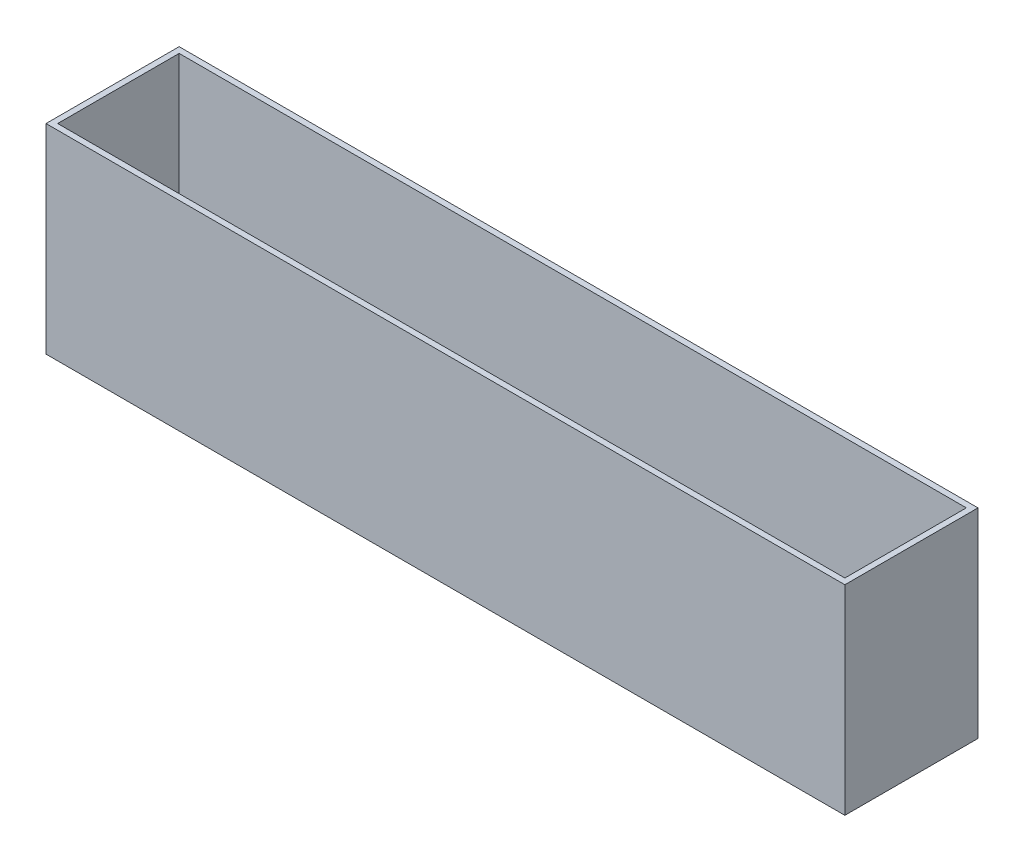
ISO-10303-21;
HEADER;
FILE_DESCRIPTION(('STEP AP214'),'2;1');
FILE_NAME('part.step','',(''),(''),'','','');
FILE_SCHEMA(('AUTOMOTIVE_DESIGN { 1 0 10303 214 1 1 1 1 }'));
ENDSEC;
DATA;
#1=APPLICATION_CONTEXT('core data for automotive mechanical design processes');
#2=APPLICATION_PROTOCOL_DEFINITION('international standard','automotive_design',2000,#1);
#3=PRODUCT_CONTEXT('',#1,'mechanical');
#4=PRODUCT('Part','Part','',(#3));
#5=PRODUCT_RELATED_PRODUCT_CATEGORY('part','',(#4));
#6=PRODUCT_DEFINITION_FORMATION('','',#4);
#7=PRODUCT_DEFINITION_CONTEXT('part definition',#1,'design');
#8=PRODUCT_DEFINITION('design','',#6,#7);
#9=PRODUCT_DEFINITION_SHAPE('','',#8);
#10=(LENGTH_UNIT() NAMED_UNIT(*) SI_UNIT(.MILLI.,.METRE.));
#11=(NAMED_UNIT(*) PLANE_ANGLE_UNIT() SI_UNIT($,.RADIAN.));
#12=(NAMED_UNIT(*) SI_UNIT($,.STERADIAN.) SOLID_ANGLE_UNIT());
#13=UNCERTAINTY_MEASURE_WITH_UNIT(LENGTH_MEASURE(1.E-05),#10,'distance_accuracy_value','');
#14=(GEOMETRIC_REPRESENTATION_CONTEXT(3) GLOBAL_UNCERTAINTY_ASSIGNED_CONTEXT((#13)) GLOBAL_UNIT_ASSIGNED_CONTEXT((#10,
#11,#12)) REPRESENTATION_CONTEXT('',''));
#15=CARTESIAN_POINT('',(0.,0.,0.));
#16=DIRECTION('',(0.,0.,1.));
#17=DIRECTION('',(1.,0.,0.));
#18=AXIS2_PLACEMENT_3D('',#15,#16,#17);
#19=CARTESIAN_POINT('',(0.,300.,0.));
#20=DIRECTION('',(1.,0.,0.));
#21=DIRECTION('',(0.,0.,-1.));
#22=AXIS2_PLACEMENT_3D('',#19,#20,#21);
#23=PLANE('',#22);
#24=DIRECTION('',(0.,0.,1.));
#25=VECTOR('',#24,1.);
#26=CARTESIAN_POINT('',(0.,0.,0.));
#27=LINE('',#26,#25);
#28=CARTESIAN_POINT('',(0.,0.,-200.));
#29=VERTEX_POINT('',#28);
#30=CARTESIAN_POINT('',(0.,0.,0.));
#31=VERTEX_POINT('',#30);
#32=EDGE_CURVE('E158',#29,#31,#27,.T.);
#33=ORIENTED_EDGE('',*,*,#32,.T.);
#34=DIRECTION('',(0.,-1.,0.));
#35=VECTOR('',#34,1.);
#36=CARTESIAN_POINT('',(0.,300.,0.));
#37=LINE('',#36,#35);
#38=CARTESIAN_POINT('',(0.,300.,0.));
#39=VERTEX_POINT('',#38);
#40=EDGE_CURVE('E11',#39,#31,#37,.T.);
#41=ORIENTED_EDGE('',*,*,#40,.F.);
#42=DIRECTION('',(0.,0.,1.));
#43=VECTOR('',#42,1.);
#44=CARTESIAN_POINT('',(0.,300.,0.));
#45=LINE('',#44,#43);
#46=CARTESIAN_POINT('',(0.,300.,-200.));
#47=VERTEX_POINT('',#46);
#48=EDGE_CURVE('E164',#47,#39,#45,.T.);
#49=ORIENTED_EDGE('',*,*,#48,.F.);
#50=DIRECTION('',(0.,-1.,0.));
#51=VECTOR('',#50,1.);
#52=CARTESIAN_POINT('',(0.,300.,-200.));
#53=LINE('',#52,#51);
#54=EDGE_CURVE('E174',#47,#29,#53,.T.);
#55=ORIENTED_EDGE('',*,*,#54,.T.);
#56=EDGE_LOOP('',(#33,#41,#49,#55));
#57=FACE_BOUND('',#56,.T.);
#58=ADVANCED_FACE('F39',(#57),#23,.F.);
#59=CARTESIAN_POINT('',(0.,300.,0.));
#60=DIRECTION('',(0.,0.,-1.));
#61=DIRECTION('',(-1.,0.,0.));
#62=AXIS2_PLACEMENT_3D('',#59,#60,#61);
#63=PLANE('',#62);
#64=DIRECTION('',(1.,0.,0.));
#65=VECTOR('',#64,1.);
#66=CARTESIAN_POINT('',(0.,0.,0.));
#67=LINE('',#66,#65);
#68=CARTESIAN_POINT('',(1200.,0.,0.));
#69=VERTEX_POINT('',#68);
#70=EDGE_CURVE('E178',#31,#69,#67,.T.);
#71=ORIENTED_EDGE('',*,*,#70,.T.);
#72=DIRECTION('',(0.,-1.,0.));
#73=VECTOR('',#72,1.);
#74=CARTESIAN_POINT('',(1200.,300.,0.));
#75=LINE('',#74,#73);
#76=CARTESIAN_POINT('',(1200.,300.,0.));
#77=VERTEX_POINT('',#76);
#78=EDGE_CURVE('E47',#77,#69,#75,.T.);
#79=ORIENTED_EDGE('',*,*,#78,.F.);
#80=DIRECTION('',(1.,0.,0.));
#81=VECTOR('',#80,1.);
#82=CARTESIAN_POINT('',(0.,300.,0.));
#83=LINE('',#82,#81);
#84=EDGE_CURVE('E91',#39,#77,#83,.T.);
#85=ORIENTED_EDGE('',*,*,#84,.F.);
#86=ORIENTED_EDGE('',*,*,#40,.T.);
#87=EDGE_LOOP('',(#71,#79,#85,#86));
#88=FACE_BOUND('',#87,.T.);
#89=ADVANCED_FACE('F213',(#88),#63,.F.);
#90=CARTESIAN_POINT('',(1200.,300.,0.));
#91=DIRECTION('',(-1.,0.,0.));
#92=DIRECTION('',(0.,0.,1.));
#93=AXIS2_PLACEMENT_3D('',#90,#91,#92);
#94=PLANE('',#93);
#95=DIRECTION('',(0.,0.,-1.));
#96=VECTOR('',#95,1.);
#97=CARTESIAN_POINT('',(1200.,0.,0.));
#98=LINE('',#97,#96);
#99=CARTESIAN_POINT('',(1200.,0.,-200.));
#100=VERTEX_POINT('',#99);
#101=EDGE_CURVE('E181',#69,#100,#98,.T.);
#102=ORIENTED_EDGE('',*,*,#101,.T.);
#103=DIRECTION('',(0.,-1.,0.));
#104=VECTOR('',#103,1.);
#105=CARTESIAN_POINT('',(1200.,300.,-200.));
#106=LINE('',#105,#104);
#107=CARTESIAN_POINT('',(1200.,300.,-200.));
#108=VERTEX_POINT('',#107);
#109=EDGE_CURVE('E188',#108,#100,#106,.T.);
#110=ORIENTED_EDGE('',*,*,#109,.F.);
#111=DIRECTION('',(0.,0.,-1.));
#112=VECTOR('',#111,1.);
#113=CARTESIAN_POINT('',(1200.,300.,0.));
#114=LINE('',#113,#112);
#115=EDGE_CURVE('E169',#77,#108,#114,.T.);
#116=ORIENTED_EDGE('',*,*,#115,.F.);
#117=ORIENTED_EDGE('',*,*,#78,.T.);
#118=EDGE_LOOP('',(#102,#110,#116,#117));
#119=FACE_BOUND('',#118,.T.);
#120=ADVANCED_FACE('F195',(#119),#94,.F.);
#121=CARTESIAN_POINT('',(0.,300.,-200.));
#122=DIRECTION('',(0.,0.,1.));
#123=DIRECTION('',(1.,0.,0.));
#124=AXIS2_PLACEMENT_3D('',#121,#122,#123);
#125=PLANE('',#124);
#126=DIRECTION('',(-1.,0.,0.));
#127=VECTOR('',#126,1.);
#128=CARTESIAN_POINT('',(0.,0.,-200.));
#129=LINE('',#128,#127);
#130=EDGE_CURVE('E84',#100,#29,#129,.T.);
#131=ORIENTED_EDGE('',*,*,#130,.T.);
#132=ORIENTED_EDGE('',*,*,#54,.F.);
#133=DIRECTION('',(-1.,0.,0.));
#134=VECTOR('',#133,1.);
#135=CARTESIAN_POINT('',(0.,300.,-200.));
#136=LINE('',#135,#134);
#137=EDGE_CURVE('E63',#108,#47,#136,.T.);
#138=ORIENTED_EDGE('',*,*,#137,.F.);
#139=ORIENTED_EDGE('',*,*,#109,.T.);
#140=EDGE_LOOP('',(#131,#132,#138,#139));
#141=FACE_BOUND('',#140,.T.);
#142=ADVANCED_FACE('F203',(#141),#125,.F.);
#143=CARTESIAN_POINT('',(0.,300.,0.));
#144=DIRECTION('',(0.,-1.,0.));
#145=DIRECTION('',(0.,0.,-1.));
#146=AXIS2_PLACEMENT_3D('',#143,#144,#145);
#147=PLANE('',#146);
#148=DIRECTION('',(1.,0.,0.));
#149=VECTOR('',#148,1.);
#150=CARTESIAN_POINT('',(8.76300000000002,300.,-8.763));
#151=LINE('',#150,#149);
#152=CARTESIAN_POINT('',(8.76300000000002,300.,-8.763));
#153=VERTEX_POINT('',#152);
#154=CARTESIAN_POINT('',(1191.237,300.,-8.763));
#155=VERTEX_POINT('',#154);
#156=EDGE_CURVE('E149',#153,#155,#151,.T.);
#157=ORIENTED_EDGE('',*,*,#156,.F.);
#158=DIRECTION('',(0.,0.,1.));
#159=VECTOR('',#158,1.);
#160=CARTESIAN_POINT('',(8.763,300.,-191.237));
#161=LINE('',#160,#159);
#162=CARTESIAN_POINT('',(8.763,300.,-191.237));
#163=VERTEX_POINT('',#162);
#164=EDGE_CURVE('E54',#163,#153,#161,.T.);
#165=ORIENTED_EDGE('',*,*,#164,.F.);
#166=DIRECTION('',(-1.,0.,0.));
#167=VECTOR('',#166,1.);
#168=CARTESIAN_POINT('',(8.763,300.,-191.237));
#169=LINE('',#168,#167);
#170=CARTESIAN_POINT('',(1191.237,300.,-191.237));
#171=VERTEX_POINT('',#170);
#172=EDGE_CURVE('E136',#171,#163,#169,.T.);
#173=ORIENTED_EDGE('',*,*,#172,.F.);
#174=DIRECTION('',(0.,0.,-1.));
#175=VECTOR('',#174,1.);
#176=CARTESIAN_POINT('',(1191.237,300.,-191.237));
#177=LINE('',#176,#175);
#178=EDGE_CURVE('E140',#155,#171,#177,.T.);
#179=ORIENTED_EDGE('',*,*,#178,.F.);
#180=EDGE_LOOP('',(#157,#165,#173,#179));
#181=FACE_BOUND('',#180,.T.);
#182=ORIENTED_EDGE('',*,*,#48,.T.);
#183=ORIENTED_EDGE('',*,*,#84,.T.);
#184=ORIENTED_EDGE('',*,*,#115,.T.);
#185=ORIENTED_EDGE('',*,*,#137,.T.);
#186=EDGE_LOOP('',(#182,#183,#184,#185));
#187=FACE_BOUND('',#186,.T.);
#188=ADVANCED_FACE('F205',(#181,#187),#147,.F.);
#189=CARTESIAN_POINT('',(0.,0.,0.));
#190=DIRECTION('',(0.,-1.,0.));
#191=DIRECTION('',(0.,0.,-1.));
#192=AXIS2_PLACEMENT_3D('',#189,#190,#191);
#193=PLANE('',#192);
#194=ORIENTED_EDGE('',*,*,#32,.F.);
#195=ORIENTED_EDGE('',*,*,#130,.F.);
#196=ORIENTED_EDGE('',*,*,#101,.F.);
#197=ORIENTED_EDGE('',*,*,#70,.F.);
#198=EDGE_LOOP('',(#194,#195,#196,#197));
#199=FACE_BOUND('',#198,.T.);
#200=ADVANCED_FACE('F199',(#199),#193,.T.);
#201=CARTESIAN_POINT('',(8.763,8.76300000000002,-191.237));
#202=DIRECTION('',(-1.,0.,0.));
#203=DIRECTION('',(0.,0.,1.));
#204=AXIS2_PLACEMENT_3D('',#201,#202,#203);
#205=PLANE('',#204);
#206=ORIENTED_EDGE('',*,*,#164,.T.);
#207=DIRECTION('',(0.,1.,0.));
#208=VECTOR('',#207,1.);
#209=CARTESIAN_POINT('',(8.76300000000002,8.76300000000002,-8.763));
#210=LINE('',#209,#208);
#211=CARTESIAN_POINT('',(8.76300000000002,8.76300000000002,-8.763));
#212=VERTEX_POINT('',#211);
#213=EDGE_CURVE('E111',#212,#153,#210,.T.);
#214=ORIENTED_EDGE('',*,*,#213,.F.);
#215=DIRECTION('',(0.,0.,1.));
#216=VECTOR('',#215,1.);
#217=CARTESIAN_POINT('',(8.763,8.76300000000002,-191.237));
#218=LINE('',#217,#216);
#219=CARTESIAN_POINT('',(8.763,8.76300000000002,-191.237));
#220=VERTEX_POINT('',#219);
#221=EDGE_CURVE('E115',#220,#212,#218,.T.);
#222=ORIENTED_EDGE('',*,*,#221,.F.);
#223=DIRECTION('',(0.,1.,0.));
#224=VECTOR('',#223,1.);
#225=CARTESIAN_POINT('',(8.763,8.76300000000002,-191.237));
#226=LINE('',#225,#224);
#227=EDGE_CURVE('E155',#220,#163,#226,.T.);
#228=ORIENTED_EDGE('',*,*,#227,.T.);
#229=EDGE_LOOP('',(#206,#214,#222,#228));
#230=FACE_BOUND('',#229,.T.);
#231=ADVANCED_FACE('F113',(#230),#205,.F.);
#232=CARTESIAN_POINT('',(8.763,8.76300000000002,-191.237));
#233=DIRECTION('',(0.,0.,-1.));
#234=DIRECTION('',(-1.,0.,0.));
#235=AXIS2_PLACEMENT_3D('',#232,#233,#234);
#236=PLANE('',#235);
#237=ORIENTED_EDGE('',*,*,#172,.T.);
#238=ORIENTED_EDGE('',*,*,#227,.F.);
#239=DIRECTION('',(-1.,0.,0.));
#240=VECTOR('',#239,1.);
#241=CARTESIAN_POINT('',(8.763,8.76300000000002,-191.237));
#242=LINE('',#241,#240);
#243=CARTESIAN_POINT('',(1191.237,8.76300000000002,-191.237));
#244=VERTEX_POINT('',#243);
#245=EDGE_CURVE('E122',#244,#220,#242,.T.);
#246=ORIENTED_EDGE('',*,*,#245,.F.);
#247=DIRECTION('',(0.,1.,0.));
#248=VECTOR('',#247,1.);
#249=CARTESIAN_POINT('',(1191.237,8.76300000000002,-191.237));
#250=LINE('',#249,#248);
#251=EDGE_CURVE('E159',#244,#171,#250,.T.);
#252=ORIENTED_EDGE('',*,*,#251,.T.);
#253=EDGE_LOOP('',(#237,#238,#246,#252));
#254=FACE_BOUND('',#253,.T.);
#255=ADVANCED_FACE('F252',(#254),#236,.F.);
#256=CARTESIAN_POINT('',(1191.237,8.76300000000002,-191.237));
#257=DIRECTION('',(1.,0.,0.));
#258=DIRECTION('',(0.,0.,-1.));
#259=AXIS2_PLACEMENT_3D('',#256,#257,#258);
#260=PLANE('',#259);
#261=ORIENTED_EDGE('',*,*,#178,.T.);
#262=ORIENTED_EDGE('',*,*,#251,.F.);
#263=DIRECTION('',(0.,0.,-1.));
#264=VECTOR('',#263,1.);
#265=CARTESIAN_POINT('',(1191.237,8.76300000000002,-191.237));
#266=LINE('',#265,#264);
#267=CARTESIAN_POINT('',(1191.237,8.76300000000002,-8.763));
#268=VERTEX_POINT('',#267);
#269=EDGE_CURVE('E131',#268,#244,#266,.T.);
#270=ORIENTED_EDGE('',*,*,#269,.F.);
#271=DIRECTION('',(0.,1.,0.));
#272=VECTOR('',#271,1.);
#273=CARTESIAN_POINT('',(1191.237,8.76300000000002,-8.763));
#274=LINE('',#273,#272);
#275=EDGE_CURVE('E121',#268,#155,#274,.T.);
#276=ORIENTED_EDGE('',*,*,#275,.T.);
#277=EDGE_LOOP('',(#261,#262,#270,#276));
#278=FACE_BOUND('',#277,.T.);
#279=ADVANCED_FACE('F261',(#278),#260,.F.);
#280=CARTESIAN_POINT('',(8.76300000000002,8.76300000000002,-8.763));
#281=DIRECTION('',(0.,0.,1.));
#282=DIRECTION('',(1.,0.,0.));
#283=AXIS2_PLACEMENT_3D('',#280,#281,#282);
#284=PLANE('',#283);
#285=ORIENTED_EDGE('',*,*,#156,.T.);
#286=ORIENTED_EDGE('',*,*,#275,.F.);
#287=DIRECTION('',(1.,0.,0.));
#288=VECTOR('',#287,1.);
#289=CARTESIAN_POINT('',(8.76300000000002,8.76300000000002,-8.763));
#290=LINE('',#289,#288);
#291=EDGE_CURVE('E125',#212,#268,#290,.T.);
#292=ORIENTED_EDGE('',*,*,#291,.F.);
#293=ORIENTED_EDGE('',*,*,#213,.T.);
#294=EDGE_LOOP('',(#285,#286,#292,#293));
#295=FACE_BOUND('',#294,.T.);
#296=ADVANCED_FACE('F126',(#295),#284,.F.);
#297=CARTESIAN_POINT('',(0.,8.76300000000002,0.));
#298=DIRECTION('',(0.,1.,0.));
#299=DIRECTION('',(0.,0.,1.));
#300=AXIS2_PLACEMENT_3D('',#297,#298,#299);
#301=PLANE('',#300);
#302=ORIENTED_EDGE('',*,*,#221,.T.);
#303=ORIENTED_EDGE('',*,*,#291,.T.);
#304=ORIENTED_EDGE('',*,*,#269,.T.);
#305=ORIENTED_EDGE('',*,*,#245,.T.);
#306=EDGE_LOOP('',(#302,#303,#304,#305));
#307=FACE_BOUND('',#306,.T.);
#308=ADVANCED_FACE('F133',(#307),#301,.T.);
#309=CLOSED_SHELL('',(#58,#89,#120,#142,#188,#200,#231,#255,#279,#296,#308));
#310=MANIFOLD_SOLID_BREP('B2',#309);
#311=ADVANCED_BREP_SHAPE_REPRESENTATION('',(#18,#310),#14);
#312=SHAPE_DEFINITION_REPRESENTATION(#9,#311);
ENDSEC;
END-ISO-10303-21;
